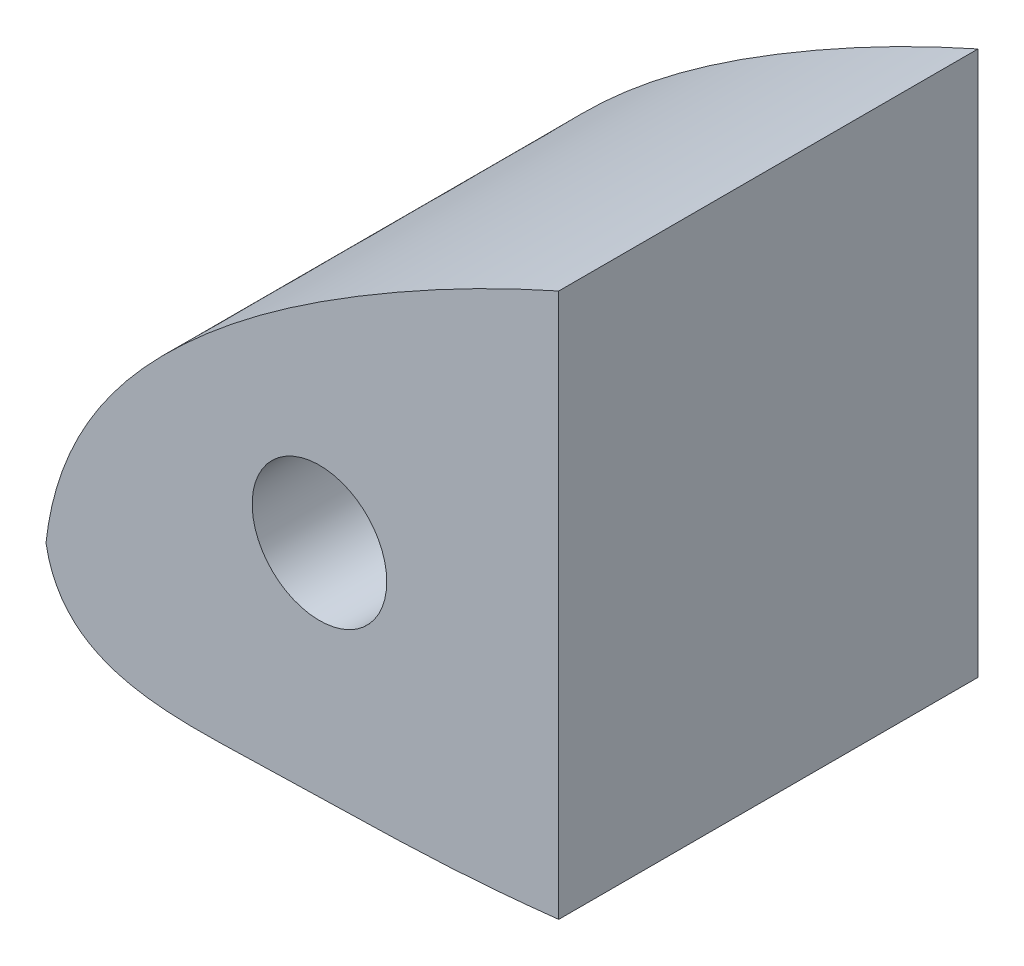
ISO-10303-21;
HEADER;
FILE_DESCRIPTION(('STEP AP214'),'2;1');
FILE_NAME('part.step','',(''),(''),'','','');
FILE_SCHEMA(('AUTOMOTIVE_DESIGN { 1 0 10303 214 1 1 1 1 }'));
ENDSEC;
DATA;
#1=APPLICATION_CONTEXT('core data for automotive mechanical design processes');
#2=APPLICATION_PROTOCOL_DEFINITION('international standard','automotive_design',2000,#1);
#3=PRODUCT_CONTEXT('',#1,'mechanical');
#4=PRODUCT('Part','Part','',(#3));
#5=PRODUCT_RELATED_PRODUCT_CATEGORY('part','',(#4));
#6=PRODUCT_DEFINITION_FORMATION('','',#4);
#7=PRODUCT_DEFINITION_CONTEXT('part definition',#1,'design');
#8=PRODUCT_DEFINITION('design','',#6,#7);
#9=PRODUCT_DEFINITION_SHAPE('','',#8);
#10=(LENGTH_UNIT() NAMED_UNIT(*) SI_UNIT(.MILLI.,.METRE.));
#11=(NAMED_UNIT(*) PLANE_ANGLE_UNIT() SI_UNIT($,.RADIAN.));
#12=(NAMED_UNIT(*) SI_UNIT($,.STERADIAN.) SOLID_ANGLE_UNIT());
#13=UNCERTAINTY_MEASURE_WITH_UNIT(LENGTH_MEASURE(1.E-05),#10,'distance_accuracy_value','');
#14=(GEOMETRIC_REPRESENTATION_CONTEXT(3) GLOBAL_UNCERTAINTY_ASSIGNED_CONTEXT((#13)) GLOBAL_UNIT_ASSIGNED_CONTEXT((#10,
#11,#12)) REPRESENTATION_CONTEXT('',''));
#15=CARTESIAN_POINT('',(0.,0.,0.));
#16=DIRECTION('',(0.,0.,1.));
#17=DIRECTION('',(1.,0.,0.));
#18=AXIS2_PLACEMENT_3D('',#15,#16,#17);
#19=CARTESIAN_POINT('',(0.000560351162113587,0.000130087070423624,31.1531));
#20=CARTESIAN_POINT('',(1.23071418869678,-6.92407609127206,31.1531));
#21=CARTESIAN_POINT('',(15.3166033306834,-6.18906584099094,31.1531));
#22=CARTESIAN_POINT('',(36.4546728163185,-6.09849990105009,31.1531));
#23=CARTESIAN_POINT('',(66.5061971849192,-0.586669106973501,31.1531));
#24=CARTESIAN_POINT('',(110.497331171581,6.18149522271792,31.1531));
#25=CARTESIAN_POINT('',(157.718638091679,9.03065014873911,31.1531));
#26=CARTESIAN_POINT('',(205.10142463584,8.83808028186313,31.1531));
#27=CARTESIAN_POINT('',(235.858814759408,7.87030619247826,31.1531));
#28=CARTESIAN_POINT('',(260.846344817159,5.42741339404395,31.1531));
#29=CARTESIAN_POINT('',(276.264022989737,4.51435670375389,31.1531));
#30=CARTESIAN_POINT('',(293.989507544058,2.09398731346533,31.1531));
#31=CARTESIAN_POINT('',(303.956832564589,1.47095520994628,31.1531));
#32=CARTESIAN_POINT('',(309.846313894505,0.000130087070423666,31.1531));
#33=B_SPLINE_CURVE_WITH_KNOTS('',3,(#19,#20,#21,#22,#23,#24,#25,#26,#27,#28,#29,#30,#31,#32),
.UNSPECIFIED.,.F.,.F.,(4,1,1,1,1,1,1,1,1,1,1,4),(0.,0.0569078595717698,0.106482711504673,
0.214488052979465,0.341297688349143,0.535095665520157,0.664680853556909,0.794660698192775,
0.828978881532905,0.904725108725214,0.942212919019968,1.),.UNSPECIFIED.);
#34=DIRECTION('',(0.,0.,-1.));
#35=VECTOR('',#34,1.);
#36=SURFACE_OF_LINEAR_EXTRUSION('',#33,#35);
#37=CARTESIAN_POINT('',(0.000560351162113587,0.000130087070423624,0.));
#38=CARTESIAN_POINT('',(1.23071418869678,-6.92407609127206,0.));
#39=CARTESIAN_POINT('',(15.3166033306834,-6.18906584099094,0.));
#40=CARTESIAN_POINT('',(36.4546728163185,-6.09849990105009,0.));
#41=CARTESIAN_POINT('',(66.5061971849192,-0.586669106973501,0.));
#42=CARTESIAN_POINT('',(110.497331171581,6.18149522271792,0.));
#43=CARTESIAN_POINT('',(157.718638091679,9.03065014873911,0.));
#44=CARTESIAN_POINT('',(205.10142463584,8.83808028186313,0.));
#45=CARTESIAN_POINT('',(235.858814759408,7.87030619247826,0.));
#46=CARTESIAN_POINT('',(260.846344817159,5.42741339404395,0.));
#47=CARTESIAN_POINT('',(276.264022989737,4.51435670375389,0.));
#48=CARTESIAN_POINT('',(293.989507544058,2.09398731346533,0.));
#49=CARTESIAN_POINT('',(303.956832564589,1.47095520994628,0.));
#50=CARTESIAN_POINT('',(309.846313894505,0.000130087070423666,0.));
#51=B_SPLINE_CURVE_WITH_KNOTS('',3,(#37,#38,#39,#40,#41,#42,#43,#44,#45,#46,#47,#48,#49,#50),
.UNSPECIFIED.,.F.,.F.,(4,1,1,1,1,1,1,1,1,1,1,4),(0.,0.0569078595717698,0.106482711504673,
0.214488052979465,0.341297688349143,0.535095665520157,0.664680853556909,0.794660698192775,
0.828978881532905,0.904725108725214,0.942212919019968,1.),.UNSPECIFIED.);
#52=CARTESIAN_POINT('',(0.000560351162116727,0.000130087070423829,0.));
#53=VERTEX_POINT('',#52);
#54=CARTESIAN_POINT('',(38.0999999979874,-5.18097252426853,0.));
#55=VERTEX_POINT('',#54);
#56=EDGE_CURVE('E90',#53,#55,#51,.T.);
#57=ORIENTED_EDGE('',*,*,#56,.T.);
#58=DIRECTION('',(0.,0.,-1.));
#59=VECTOR('',#58,1.);
#60=CARTESIAN_POINT('',(38.1,-5.18097252404465,31.1531));
#61=LINE('',#60,#59);
#62=CARTESIAN_POINT('',(38.1,-5.18097252426854,31.1531));
#63=VERTEX_POINT('',#62);
#64=EDGE_CURVE('E49',#55,#63,#61,.F.);
#65=ORIENTED_EDGE('',*,*,#64,.T.);
#66=CARTESIAN_POINT('',(0.000560351162116727,0.000130087070423829,31.1531));
#67=VERTEX_POINT('',#66);
#68=EDGE_CURVE('E77',#67,#63,#33,.T.);
#69=ORIENTED_EDGE('',*,*,#68,.F.);
#70=DIRECTION('',(0.,0.,-1.));
#71=VECTOR('',#70,1.);
#72=CARTESIAN_POINT('',(0.000560351162116727,0.000130087070423829,31.1531));
#73=LINE('',#72,#71);
#74=EDGE_CURVE('E11',#67,#53,#73,.T.);
#75=ORIENTED_EDGE('',*,*,#74,.T.);
#76=EDGE_LOOP('',(#57,#65,#69,#75));
#77=FACE_BOUND('',#76,.T.);
#78=ADVANCED_FACE('F34',(#77),#36,.F.);
#79=CARTESIAN_POINT('',(309.846313894505,0.000130087070423864,31.1531));
#80=CARTESIAN_POINT('',(314.816918223261,-0.51620674157964,31.1531));
#81=CARTESIAN_POINT('',(301.273197720551,4.38282813873556,31.1531));
#82=CARTESIAN_POINT('',(290.359837670022,8.71099439045776,31.1531));
#83=CARTESIAN_POINT('',(256.952064400645,19.5289209482833,31.1531));
#84=CARTESIAN_POINT('',(217.961060472083,29.6129748944238,31.1531));
#85=CARTESIAN_POINT('',(173.256699242147,40.0411042779434,31.1531));
#86=CARTESIAN_POINT('',(131.400792108858,47.8848319151037,31.1531));
#87=CARTESIAN_POINT('',(89.5976184754884,49.290763053775,31.1531));
#88=CARTESIAN_POINT('',(52.1111282710831,42.0692152748914,31.1531));
#89=CARTESIAN_POINT('',(26.2867198183782,29.9751763284633,31.1531));
#90=CARTESIAN_POINT('',(8.64909202481883,17.8566051741579,31.1531));
#91=CARTESIAN_POINT('',(0.810633126632263,7.35919605469637,31.1531));
#92=CARTESIAN_POINT('',(0.000560351162116727,0.000130087070423829,31.1531));
#93=B_SPLINE_CURVE_WITH_KNOTS('',3,(#79,#80,#81,#82,#83,#84,#85,#86,#87,#88,#89,#90,#91,#92),
.UNSPECIFIED.,.F.,.F.,(4,1,1,1,1,1,1,1,1,1,1,4),(0.,0.0239417713693992,0.070244030177139,
0.147561721425381,0.308455887006792,0.442387865106874,0.551517565626309,0.687091076796298,
0.811391258419108,0.886311735305172,0.939136382225768,1.),.UNSPECIFIED.);
#94=DIRECTION('',(0.,0.,-1.));
#95=VECTOR('',#94,1.);
#96=SURFACE_OF_LINEAR_EXTRUSION('',#93,#95);
#97=CARTESIAN_POINT('',(38.1,35.2581330206231,31.1531));
#98=VERTEX_POINT('',#97);
#99=EDGE_CURVE('E42',#98,#67,#93,.T.);
#100=ORIENTED_EDGE('',*,*,#99,.F.);
#101=DIRECTION('',(0.,0.,-1.));
#102=VECTOR('',#101,1.);
#103=CARTESIAN_POINT('',(38.1,35.2581330224171,31.1531));
#104=LINE('',#103,#102);
#105=CARTESIAN_POINT('',(38.1,35.2581330206231,0.));
#106=VERTEX_POINT('',#105);
#107=EDGE_CURVE('E68',#98,#106,#104,.T.);
#108=ORIENTED_EDGE('',*,*,#107,.T.);
#109=CARTESIAN_POINT('',(309.846313894505,0.000130087070423864,0.));
#110=CARTESIAN_POINT('',(314.816918223261,-0.51620674157964,0.));
#111=CARTESIAN_POINT('',(301.273197720551,4.38282813873556,0.));
#112=CARTESIAN_POINT('',(290.359837670022,8.71099439045776,0.));
#113=CARTESIAN_POINT('',(256.952064400645,19.5289209482833,0.));
#114=CARTESIAN_POINT('',(217.961060472083,29.6129748944238,0.));
#115=CARTESIAN_POINT('',(173.256699242147,40.0411042779434,0.));
#116=CARTESIAN_POINT('',(131.400792108858,47.8848319151037,0.));
#117=CARTESIAN_POINT('',(89.5976184754884,49.290763053775,0.));
#118=CARTESIAN_POINT('',(52.1111282710831,42.0692152748914,0.));
#119=CARTESIAN_POINT('',(26.2867198183782,29.9751763284633,0.));
#120=CARTESIAN_POINT('',(8.64909202481883,17.8566051741579,0.));
#121=CARTESIAN_POINT('',(0.810633126632263,7.35919605469637,0.));
#122=CARTESIAN_POINT('',(0.000560351162116727,0.000130087070423829,0.));
#123=B_SPLINE_CURVE_WITH_KNOTS('',3,(#109,#110,#111,#112,#113,#114,#115,#116,#117,#118,#119,
#120,#121,#122),.UNSPECIFIED.,.F.,.F.,(4,1,1,1,1,1,1,1,1,1,1,4),(0.,0.0239417713693992,
0.070244030177139,0.147561721425381,0.308455887006792,0.442387865106874,0.551517565626309,
0.687091076796298,0.811391258419108,0.886311735305172,0.939136382225768,1.),.UNSPECIFIED.);
#124=EDGE_CURVE('E81',#106,#53,#123,.T.);
#125=ORIENTED_EDGE('',*,*,#124,.T.);
#126=ORIENTED_EDGE('',*,*,#74,.F.);
#127=EDGE_LOOP('',(#100,#108,#125,#126));
#128=FACE_BOUND('',#127,.T.);
#129=ADVANCED_FACE('F79',(#128),#96,.F.);
#130=CARTESIAN_POINT('',(153.387816973495,8.33338198857885,31.1531));
#131=DIRECTION('',(0.,0.,-1.));
#132=DIRECTION('',(-1.,0.,0.));
#133=AXIS2_PLACEMENT_3D('',#130,#131,#132);
#134=PLANE('',#133);
#135=CARTESIAN_POINT('',(20.32,10.16,31.1531));
#136=DIRECTION('',(0.,0.,1.));
#137=DIRECTION('',(1.,0.,0.));
#138=AXIS2_PLACEMENT_3D('',#135,#136,#137);
#139=CIRCLE('',#138,5.);
#140=CARTESIAN_POINT('',(25.32,10.16,31.1531));
#141=VERTEX_POINT('',#140);
#142=EDGE_CURVE('E120',#141,#141,#139,.T.);
#143=ORIENTED_EDGE('',*,*,#142,.F.);
#144=EDGE_LOOP('',(#143));
#145=FACE_BOUND('',#144,.T.);
#146=ORIENTED_EDGE('',*,*,#68,.T.);
#147=DIRECTION('',(0.,-1.,0.));
#148=VECTOR('',#147,1.);
#149=CARTESIAN_POINT('',(38.1,71.7179988353335,31.1531));
#150=LINE('',#149,#148);
#151=EDGE_CURVE('E70',#98,#63,#150,.T.);
#152=ORIENTED_EDGE('',*,*,#151,.F.);
#153=ORIENTED_EDGE('',*,*,#99,.T.);
#154=EDGE_LOOP('',(#146,#152,#153));
#155=FACE_BOUND('',#154,.T.);
#156=ADVANCED_FACE('F75',(#145,#155),#134,.F.);
#157=CARTESIAN_POINT('',(153.387816973495,8.33338198857885,0.));
#158=DIRECTION('',(0.,0.,-1.));
#159=DIRECTION('',(-1.,0.,0.));
#160=AXIS2_PLACEMENT_3D('',#157,#158,#159);
#161=PLANE('',#160);
#162=DIRECTION('',(0.,-1.,0.));
#163=VECTOR('',#162,1.);
#164=CARTESIAN_POINT('',(38.1,71.7179988353335,0.));
#165=LINE('',#164,#163);
#166=EDGE_CURVE('E71',#106,#55,#165,.T.);
#167=ORIENTED_EDGE('',*,*,#166,.T.);
#168=ORIENTED_EDGE('',*,*,#56,.F.);
#169=ORIENTED_EDGE('',*,*,#124,.F.);
#170=EDGE_LOOP('',(#167,#168,#169));
#171=FACE_BOUND('',#170,.T.);
#172=CARTESIAN_POINT('',(20.32,10.16,0.));
#173=DIRECTION('',(0.,0.,1.));
#174=DIRECTION('',(1.,0.,0.));
#175=AXIS2_PLACEMENT_3D('',#172,#173,#174);
#176=CIRCLE('',#175,5.);
#177=CARTESIAN_POINT('',(25.32,10.16,0.));
#178=VERTEX_POINT('',#177);
#179=EDGE_CURVE('E118',#178,#178,#176,.T.);
#180=ORIENTED_EDGE('',*,*,#179,.T.);
#181=EDGE_LOOP('',(#180));
#182=FACE_BOUND('',#181,.T.);
#183=ADVANCED_FACE('F98',(#171,#182),#161,.T.);
#184=CARTESIAN_POINT('',(20.32,10.16,0.));
#185=DIRECTION('',(0.,0.,1.));
#186=DIRECTION('',(1.,0.,0.));
#187=AXIS2_PLACEMENT_3D('',#184,#185,#186);
#188=CYLINDRICAL_SURFACE('',#187,5.);
#189=ORIENTED_EDGE('',*,*,#179,.F.);
#190=EDGE_LOOP('',(#189));
#191=FACE_BOUND('',#190,.T.);
#192=ORIENTED_EDGE('',*,*,#142,.T.);
#193=EDGE_LOOP('',(#192));
#194=FACE_BOUND('',#193,.T.);
#195=ADVANCED_FACE('F101',(#191,#194),#188,.F.);
#196=CARTESIAN_POINT('',(38.1,71.7179988353335,0.));
#197=DIRECTION('',(-1.,0.,0.));
#198=DIRECTION('',(0.,-1.,0.));
#199=AXIS2_PLACEMENT_3D('',#196,#197,#198);
#200=PLANE('',#199);
#201=ORIENTED_EDGE('',*,*,#166,.F.);
#202=ORIENTED_EDGE('',*,*,#107,.F.);
#203=ORIENTED_EDGE('',*,*,#151,.T.);
#204=ORIENTED_EDGE('',*,*,#64,.F.);
#205=EDGE_LOOP('',(#201,#202,#203,#204));
#206=FACE_BOUND('',#205,.T.);
#207=ADVANCED_FACE('F69',(#206),#200,.F.);
#208=CLOSED_SHELL('',(#78,#129,#156,#183,#195,#207));
#209=MANIFOLD_SOLID_BREP('B2',#208);
#210=ADVANCED_BREP_SHAPE_REPRESENTATION('',(#18,#209),#14);
#211=SHAPE_DEFINITION_REPRESENTATION(#9,#210);
ENDSEC;
END-ISO-10303-21;
